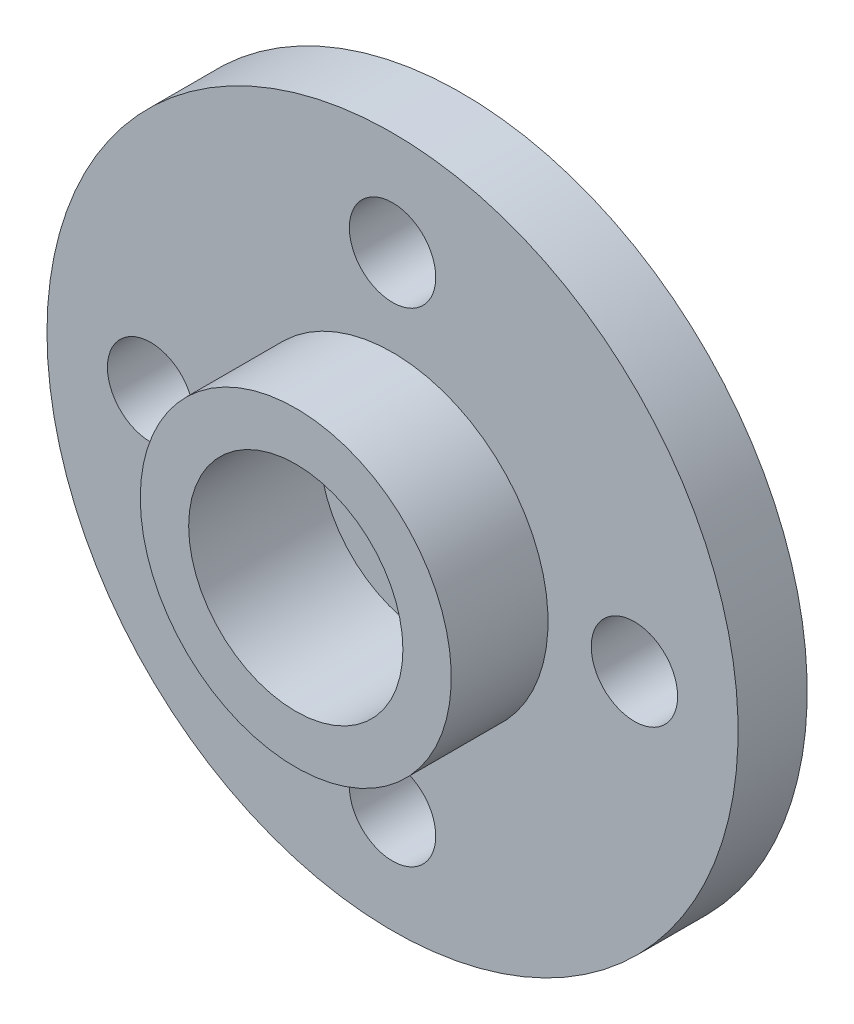
ISO-10303-21;
HEADER;
FILE_DESCRIPTION(('STEP AP214'),'2;1');
FILE_NAME('part.step','',(''),(''),'','','');
FILE_SCHEMA(('AUTOMOTIVE_DESIGN { 1 0 10303 214 1 1 1 1 }'));
ENDSEC;
DATA;
#1=APPLICATION_CONTEXT('core data for automotive mechanical design processes');
#2=APPLICATION_PROTOCOL_DEFINITION('international standard','automotive_design',2000,#1);
#3=PRODUCT_CONTEXT('',#1,'mechanical');
#4=PRODUCT('Part','Part','',(#3));
#5=PRODUCT_RELATED_PRODUCT_CATEGORY('part','',(#4));
#6=PRODUCT_DEFINITION_FORMATION('','',#4);
#7=PRODUCT_DEFINITION_CONTEXT('part definition',#1,'design');
#8=PRODUCT_DEFINITION('design','',#6,#7);
#9=PRODUCT_DEFINITION_SHAPE('','',#8);
#10=(LENGTH_UNIT() NAMED_UNIT(*) SI_UNIT(.MILLI.,.METRE.));
#11=(NAMED_UNIT(*) PLANE_ANGLE_UNIT() SI_UNIT($,.RADIAN.));
#12=(NAMED_UNIT(*) SI_UNIT($,.STERADIAN.) SOLID_ANGLE_UNIT());
#13=UNCERTAINTY_MEASURE_WITH_UNIT(LENGTH_MEASURE(1.E-05),#10,'distance_accuracy_value','');
#14=(GEOMETRIC_REPRESENTATION_CONTEXT(3) GLOBAL_UNCERTAINTY_ASSIGNED_CONTEXT((#13)) GLOBAL_UNIT_ASSIGNED_CONTEXT((#10,
#11,#12)) REPRESENTATION_CONTEXT('',''));
#15=CARTESIAN_POINT('',(0.,0.,0.));
#16=DIRECTION('',(0.,0.,1.));
#17=DIRECTION('',(1.,0.,0.));
#18=AXIS2_PLACEMENT_3D('',#15,#16,#17);
#19=CARTESIAN_POINT('',(-39.10264651977,-19.8999981269,-34.124));
#20=DIRECTION('',(0.,0.,-1.));
#21=DIRECTION('',(-1.,0.,0.));
#22=AXIS2_PLACEMENT_3D('',#19,#20,#21);
#23=CYLINDRICAL_SURFACE('',#22,10.);
#24=CARTESIAN_POINT('',(-39.10264651977,-19.8999981269,-34.124));
#25=DIRECTION('',(0.,0.,-1.));
#26=DIRECTION('',(-1.,0.,0.));
#27=AXIS2_PLACEMENT_3D('',#24,#25,#26);
#28=CIRCLE('',#27,10.);
#29=CARTESIAN_POINT('',(-49.10264651977,-19.8999981269,-34.124));
#30=VERTEX_POINT('',#29);
#31=EDGE_CURVE('E36',#30,#30,#28,.T.);
#32=ORIENTED_EDGE('',*,*,#31,.T.);
#33=EDGE_LOOP('',(#32));
#34=FACE_BOUND('',#33,.T.);
#35=CARTESIAN_POINT('',(-39.10264651977,-19.8999981269,-36.124));
#36=DIRECTION('',(0.,0.,-1.));
#37=DIRECTION('',(-1.,0.,0.));
#38=AXIS2_PLACEMENT_3D('',#35,#36,#37);
#39=CIRCLE('',#38,10.);
#40=CARTESIAN_POINT('',(-49.10264651977,-19.8999981269,-36.124));
#41=VERTEX_POINT('',#40);
#42=EDGE_CURVE('E46',#41,#41,#39,.T.);
#43=ORIENTED_EDGE('',*,*,#42,.F.);
#44=EDGE_LOOP('',(#43));
#45=FACE_BOUND('',#44,.T.);
#46=ADVANCED_FACE('F34',(#34,#45),#23,.T.);
#47=CARTESIAN_POINT('',(-29.10264651977,-19.8999981269,-34.124));
#48=DIRECTION('',(0.,0.,1.));
#49=DIRECTION('',(1.,0.,0.));
#50=AXIS2_PLACEMENT_3D('',#47,#48,#49);
#51=PLANE('',#50);
#52=CARTESIAN_POINT('',(-46.10264839287,-19.8999981269,-34.124));
#53=DIRECTION('',(0.,0.,1.));
#54=DIRECTION('',(1.,0.,0.));
#55=AXIS2_PLACEMENT_3D('',#52,#53,#54);
#56=CIRCLE('',#55,1.24999999999999);
#57=CARTESIAN_POINT('',(-44.85264839287,-19.8999981269,-34.124));
#58=VERTEX_POINT('',#57);
#59=EDGE_CURVE('E76',#58,#58,#56,.T.);
#60=ORIENTED_EDGE('',*,*,#59,.F.);
#61=EDGE_LOOP('',(#60));
#62=FACE_BOUND('',#61,.T.);
#63=CARTESIAN_POINT('',(-39.10264651977,-12.8999962538,-34.124));
#64=DIRECTION('',(0.,0.,1.));
#65=DIRECTION('',(1.,0.,0.));
#66=AXIS2_PLACEMENT_3D('',#63,#64,#65);
#67=CIRCLE('',#66,1.24999999999999);
#68=CARTESIAN_POINT('',(-37.85264651977,-12.8999962538,-34.124));
#69=VERTEX_POINT('',#68);
#70=EDGE_CURVE('E68',#69,#69,#67,.T.);
#71=ORIENTED_EDGE('',*,*,#70,.F.);
#72=EDGE_LOOP('',(#71));
#73=FACE_BOUND('',#72,.T.);
#74=CARTESIAN_POINT('',(-32.10264464667,-19.8999981269,-34.124));
#75=DIRECTION('',(0.,0.,1.));
#76=DIRECTION('',(1.,0.,0.));
#77=AXIS2_PLACEMENT_3D('',#74,#75,#76);
#78=CIRCLE('',#77,1.24999999999999);
#79=CARTESIAN_POINT('',(-30.85264464667,-19.8999981269,-34.124));
#80=VERTEX_POINT('',#79);
#81=EDGE_CURVE('E62',#80,#80,#78,.T.);
#82=ORIENTED_EDGE('',*,*,#81,.F.);
#83=EDGE_LOOP('',(#82));
#84=FACE_BOUND('',#83,.T.);
#85=CARTESIAN_POINT('',(-39.10264651977,-26.9,-34.124));
#86=DIRECTION('',(0.,0.,1.));
#87=DIRECTION('',(1.,0.,0.));
#88=AXIS2_PLACEMENT_3D('',#85,#86,#87);
#89=CIRCLE('',#88,1.24999999999999);
#90=CARTESIAN_POINT('',(-37.85264651977,-26.9,-34.124));
#91=VERTEX_POINT('',#90);
#92=EDGE_CURVE('E53',#91,#91,#89,.T.);
#93=ORIENTED_EDGE('',*,*,#92,.F.);
#94=EDGE_LOOP('',(#93));
#95=FACE_BOUND('',#94,.T.);
#96=CARTESIAN_POINT('',(-39.10264651977,-19.8999981269,-34.124));
#97=DIRECTION('',(0.,0.,1.));
#98=DIRECTION('',(1.,0.,0.));
#99=AXIS2_PLACEMENT_3D('',#96,#97,#98);
#100=CIRCLE('',#99,4.5);
#101=CARTESIAN_POINT('',(-43.60264651977,-19.8999981269,-34.124));
#102=VERTEX_POINT('',#101);
#103=EDGE_CURVE('E10',#102,#102,#100,.T.);
#104=ORIENTED_EDGE('',*,*,#103,.F.);
#105=EDGE_LOOP('',(#104));
#106=FACE_BOUND('',#105,.T.);
#107=ORIENTED_EDGE('',*,*,#31,.F.);
#108=EDGE_LOOP('',(#107));
#109=FACE_BOUND('',#108,.T.);
#110=ADVANCED_FACE('F111',(#62,#73,#84,#95,#106,#109),#51,.T.);
#111=CARTESIAN_POINT('',(-39.10264651977,-19.8999981269,-36.124));
#112=DIRECTION('',(0.,0.,-1.));
#113=DIRECTION('',(-1.,0.,0.));
#114=AXIS2_PLACEMENT_3D('',#111,#112,#113);
#115=PLANE('',#114);
#116=CARTESIAN_POINT('',(-39.10264651977,-19.8999981269,-36.124));
#117=DIRECTION('',(0.,0.,1.));
#118=DIRECTION('',(1.,0.,0.));
#119=AXIS2_PLACEMENT_3D('',#116,#117,#118);
#120=CIRCLE('',#119,1.60000000000001);
#121=CARTESIAN_POINT('',(-37.50264651977,-19.8999981269,-36.124));
#122=VERTEX_POINT('',#121);
#123=EDGE_CURVE('E85',#122,#122,#120,.T.);
#124=ORIENTED_EDGE('',*,*,#123,.T.);
#125=EDGE_LOOP('',(#124));
#126=FACE_BOUND('',#125,.T.);
#127=CARTESIAN_POINT('',(-46.10264839287,-19.8999981269,-36.124));
#128=DIRECTION('',(0.,0.,-1.));
#129=DIRECTION('',(-1.,0.,0.));
#130=AXIS2_PLACEMENT_3D('',#127,#128,#129);
#131=CIRCLE('',#130,1.24999999999999);
#132=CARTESIAN_POINT('',(-47.35264839287,-19.8999981269,-36.124));
#133=VERTEX_POINT('',#132);
#134=EDGE_CURVE('E78',#133,#133,#131,.T.);
#135=ORIENTED_EDGE('',*,*,#134,.F.);
#136=EDGE_LOOP('',(#135));
#137=FACE_BOUND('',#136,.T.);
#138=CARTESIAN_POINT('',(-39.10264651977,-12.8999962538,-36.124));
#139=DIRECTION('',(0.,0.,-1.));
#140=DIRECTION('',(-1.,0.,0.));
#141=AXIS2_PLACEMENT_3D('',#138,#139,#140);
#142=CIRCLE('',#141,1.24999999999999);
#143=CARTESIAN_POINT('',(-40.35264651977,-12.8999962538,-36.124));
#144=VERTEX_POINT('',#143);
#145=EDGE_CURVE('E71',#144,#144,#142,.T.);
#146=ORIENTED_EDGE('',*,*,#145,.F.);
#147=EDGE_LOOP('',(#146));
#148=FACE_BOUND('',#147,.T.);
#149=CARTESIAN_POINT('',(-32.10264464667,-19.8999981269,-36.124));
#150=DIRECTION('',(0.,0.,-1.));
#151=DIRECTION('',(-1.,0.,0.));
#152=AXIS2_PLACEMENT_3D('',#149,#150,#151);
#153=CIRCLE('',#152,1.24999999999999);
#154=CARTESIAN_POINT('',(-33.35264464667,-19.8999981269,-36.124));
#155=VERTEX_POINT('',#154);
#156=EDGE_CURVE('E70',#155,#155,#153,.T.);
#157=ORIENTED_EDGE('',*,*,#156,.F.);
#158=EDGE_LOOP('',(#157));
#159=FACE_BOUND('',#158,.T.);
#160=CARTESIAN_POINT('',(-39.10264651977,-26.9,-36.124));
#161=DIRECTION('',(0.,0.,-1.));
#162=DIRECTION('',(-1.,0.,0.));
#163=AXIS2_PLACEMENT_3D('',#160,#161,#162);
#164=CIRCLE('',#163,1.24999999999999);
#165=CARTESIAN_POINT('',(-40.35264651977,-26.9,-36.124));
#166=VERTEX_POINT('',#165);
#167=EDGE_CURVE('E59',#166,#166,#164,.T.);
#168=ORIENTED_EDGE('',*,*,#167,.F.);
#169=EDGE_LOOP('',(#168));
#170=FACE_BOUND('',#169,.T.);
#171=ORIENTED_EDGE('',*,*,#42,.T.);
#172=EDGE_LOOP('',(#171));
#173=FACE_BOUND('',#172,.T.);
#174=ADVANCED_FACE('F109',(#126,#137,#148,#159,#170,#173),#115,.T.);
#175=CARTESIAN_POINT('',(-39.10264651977,-19.8999981269,-31.324));
#176=DIRECTION('',(0.,0.,-1.));
#177=DIRECTION('',(-1.,0.,0.));
#178=AXIS2_PLACEMENT_3D('',#175,#176,#177);
#179=CYLINDRICAL_SURFACE('',#178,4.5);
#180=CARTESIAN_POINT('',(-39.10264651977,-19.8999981269,-31.324));
#181=DIRECTION('',(0.,0.,1.));
#182=DIRECTION('',(1.,0.,0.));
#183=AXIS2_PLACEMENT_3D('',#180,#181,#182);
#184=CIRCLE('',#183,4.5);
#185=CARTESIAN_POINT('',(-43.60264651977,-19.8999981269,-31.324));
#186=VERTEX_POINT('',#185);
#187=EDGE_CURVE('E48',#186,#186,#184,.T.);
#188=CARTESIAN_POINT('',(-43.60264651977,-19.8999981269,-31.324));
#189=CARTESIAN_POINT('',(-43.60264651977,-19.8999981269,-31.3531666666667));
#190=CARTESIAN_POINT('',(-43.60264651977,-19.8999981269,-31.3823333333333));
#191=CARTESIAN_POINT('',(-43.60264651977,-19.8999981269,-31.4406666666667));
#192=CARTESIAN_POINT('',(-43.60264651977,-19.8999981269,-31.4698333333333));
#193=CARTESIAN_POINT('',(-43.60264651977,-19.8999981269,-31.5281666666667));
#194=CARTESIAN_POINT('',(-43.60264651977,-19.8999981269,-31.5573333333333));
#195=CARTESIAN_POINT('',(-43.60264651977,-19.8999981269,-31.6156666666667));
#196=CARTESIAN_POINT('',(-43.60264651977,-19.8999981269,-31.6448333333333));
#197=CARTESIAN_POINT('',(-43.60264651977,-19.8999981269,-31.7031666666667));
#198=CARTESIAN_POINT('',(-43.60264651977,-19.8999981269,-31.7323333333333));
#199=CARTESIAN_POINT('',(-43.60264651977,-19.8999981269,-31.7906666666667));
#200=CARTESIAN_POINT('',(-43.60264651977,-19.8999981269,-31.8198333333333));
#201=CARTESIAN_POINT('',(-43.60264651977,-19.8999981269,-31.8781666666667));
#202=CARTESIAN_POINT('',(-43.60264651977,-19.8999981269,-31.9073333333333));
#203=CARTESIAN_POINT('',(-43.60264651977,-19.8999981269,-31.9656666666667));
#204=CARTESIAN_POINT('',(-43.60264651977,-19.8999981269,-31.9948333333333));
#205=CARTESIAN_POINT('',(-43.60264651977,-19.8999981269,-32.0531666666667));
#206=CARTESIAN_POINT('',(-43.60264651977,-19.8999981269,-32.0823333333333));
#207=CARTESIAN_POINT('',(-43.60264651977,-19.8999981269,-32.1406666666667));
#208=CARTESIAN_POINT('',(-43.60264651977,-19.8999981269,-32.1698333333333));
#209=CARTESIAN_POINT('',(-43.60264651977,-19.8999981269,-32.2281666666667));
#210=CARTESIAN_POINT('',(-43.60264651977,-19.8999981269,-32.2573333333333));
#211=CARTESIAN_POINT('',(-43.60264651977,-19.8999981269,-32.3156666666667));
#212=CARTESIAN_POINT('',(-43.60264651977,-19.8999981269,-32.3448333333333));
#213=CARTESIAN_POINT('',(-43.60264651977,-19.8999981269,-32.4031666666667));
#214=CARTESIAN_POINT('',(-43.60264651977,-19.8999981269,-32.4323333333333));
#215=CARTESIAN_POINT('',(-43.60264651977,-19.8999981269,-32.4906666666667));
#216=CARTESIAN_POINT('',(-43.60264651977,-19.8999981269,-32.5198333333333));
#217=CARTESIAN_POINT('',(-43.60264651977,-19.8999981269,-32.5781666666667));
#218=CARTESIAN_POINT('',(-43.60264651977,-19.8999981269,-32.6073333333333));
#219=CARTESIAN_POINT('',(-43.60264651977,-19.8999981269,-32.6656666666667));
#220=CARTESIAN_POINT('',(-43.60264651977,-19.8999981269,-32.6948333333333));
#221=CARTESIAN_POINT('',(-43.60264651977,-19.8999981269,-32.7531666666667));
#222=CARTESIAN_POINT('',(-43.60264651977,-19.8999981269,-32.7823333333333));
#223=CARTESIAN_POINT('',(-43.60264651977,-19.8999981269,-32.8406666666667));
#224=CARTESIAN_POINT('',(-43.60264651977,-19.8999981269,-32.8698333333333));
#225=CARTESIAN_POINT('',(-43.60264651977,-19.8999981269,-32.9281666666667));
#226=CARTESIAN_POINT('',(-43.60264651977,-19.8999981269,-32.9573333333333));
#227=CARTESIAN_POINT('',(-43.60264651977,-19.8999981269,-33.0156666666667));
#228=CARTESIAN_POINT('',(-43.60264651977,-19.8999981269,-33.0448333333333));
#229=CARTESIAN_POINT('',(-43.60264651977,-19.8999981269,-33.1031666666667));
#230=CARTESIAN_POINT('',(-43.60264651977,-19.8999981269,-33.1323333333333));
#231=CARTESIAN_POINT('',(-43.60264651977,-19.8999981269,-33.1906666666667));
#232=CARTESIAN_POINT('',(-43.60264651977,-19.8999981269,-33.2198333333333));
#233=CARTESIAN_POINT('',(-43.60264651977,-19.8999981269,-33.2781666666667));
#234=CARTESIAN_POINT('',(-43.60264651977,-19.8999981269,-33.3073333333333));
#235=CARTESIAN_POINT('',(-43.60264651977,-19.8999981269,-33.3656666666667));
#236=CARTESIAN_POINT('',(-43.60264651977,-19.8999981269,-33.3948333333333));
#237=CARTESIAN_POINT('',(-43.60264651977,-19.8999981269,-33.4531666666667));
#238=CARTESIAN_POINT('',(-43.60264651977,-19.8999981269,-33.4823333333333));
#239=CARTESIAN_POINT('',(-43.60264651977,-19.8999981269,-33.5406666666667));
#240=CARTESIAN_POINT('',(-43.60264651977,-19.8999981269,-33.5698333333333));
#241=CARTESIAN_POINT('',(-43.60264651977,-19.8999981269,-33.6281666666667));
#242=CARTESIAN_POINT('',(-43.60264651977,-19.8999981269,-33.6573333333333));
#243=CARTESIAN_POINT('',(-43.60264651977,-19.8999981269,-33.7156666666667));
#244=CARTESIAN_POINT('',(-43.60264651977,-19.8999981269,-33.7448333333333));
#245=CARTESIAN_POINT('',(-43.60264651977,-19.8999981269,-33.8031666666667));
#246=CARTESIAN_POINT('',(-43.60264651977,-19.8999981269,-33.8323333333333));
#247=CARTESIAN_POINT('',(-43.60264651977,-19.8999981269,-33.8906666666667));
#248=CARTESIAN_POINT('',(-43.60264651977,-19.8999981269,-33.9198333333333));
#249=CARTESIAN_POINT('',(-43.60264651977,-19.8999981269,-33.9781666666667));
#250=CARTESIAN_POINT('',(-43.60264651977,-19.8999981269,-34.0073333333333));
#251=CARTESIAN_POINT('',(-43.60264651977,-19.8999981269,-34.0656666666667));
#252=CARTESIAN_POINT('',(-43.60264651977,-19.8999981269,-34.0948333333333));
#253=CARTESIAN_POINT('',(-43.60264651977,-19.8999981269,-34.124));
#254=B_SPLINE_CURVE_WITH_KNOTS('',3,(#188,#189,#190,#191,#192,#193,#194,#195,#196,#197,#198,
#199,#200,#201,#202,#203,#204,#205,#206,#207,#208,#209,#210,#211,#212,#213,#214,#215,#216,#217,
#218,#219,#220,#221,#222,#223,#224,#225,#226,#227,#228,#229,#230,#231,#232,#233,#234,#235,#236,
#237,#238,#239,#240,#241,#242,#243,#244,#245,#246,#247,#248,#249,#250,#251,#252,#253),
.UNSPECIFIED.,.F.,.F.,(4,2,2,2,2,2,2,2,2,2,2,2,2,2,2,2,2,2,2,2,2,2,2,2,2,2,2,2,2,2,2,2,4),(0.,
0.0875000000000042,0.175000000000002,0.262500000000006,0.350000000000003,0.4375,
0.525000000000005,0.612500000000002,0.700000000000006,0.787500000000003,0.875000000000001,
0.962500000000005,1.05,1.1375,1.225,1.3125,1.40000000000001,1.4875,1.575,1.6625,1.75,1.8375,
1.925,2.0125,2.1,2.1875,2.275,2.3625,2.45,2.5375,2.625,2.7125,2.8),.UNSPECIFIED.);
#255=EDGE_CURVE('BSEAM99',#186,#102,#254,.T.);
#256=ORIENTED_EDGE('',*,*,#187,.F.);
#257=ORIENTED_EDGE('',*,*,#103,.T.);
#258=ORIENTED_EDGE('',*,*,#255,.T.);
#259=ORIENTED_EDGE('',*,*,#255,.F.);
#260=EDGE_LOOP('',(#256,#258,#257,#259));
#261=FACE_BOUND('',#260,.T.);
#262=ADVANCED_FACE('F99',(#261),#179,.T.);
#263=CARTESIAN_POINT('',(-39.10264651977,-19.8999981269,-31.324));
#264=DIRECTION('',(0.,0.,1.));
#265=DIRECTION('',(1.,0.,0.));
#266=AXIS2_PLACEMENT_3D('',#263,#264,#265);
#267=PLANE('',#266);
#268=CARTESIAN_POINT('',(-39.10264651977,-19.8999981269,-31.324));
#269=DIRECTION('',(0.,0.,1.));
#270=DIRECTION('',(1.,0.,0.));
#271=AXIS2_PLACEMENT_3D('',#268,#269,#270);
#272=CIRCLE('',#271,3.09999999999999);
#273=CARTESIAN_POINT('',(-36.00264651977,-19.8999981269,-31.324));
#274=VERTEX_POINT('',#273);
#275=EDGE_CURVE('E93',#274,#274,#272,.T.);
#276=ORIENTED_EDGE('',*,*,#275,.F.);
#277=EDGE_LOOP('',(#276));
#278=FACE_BOUND('',#277,.T.);
#279=ORIENTED_EDGE('',*,*,#187,.T.);
#280=EDGE_LOOP('',(#279));
#281=FACE_BOUND('',#280,.T.);
#282=ADVANCED_FACE('F100',(#278,#281),#267,.T.);
#283=CARTESIAN_POINT('',(-39.10264651977,-26.9,-36.124));
#284=DIRECTION('',(0.,0.,-1.));
#285=DIRECTION('',(-1.,0.,0.));
#286=AXIS2_PLACEMENT_3D('',#283,#284,#285);
#287=CYLINDRICAL_SURFACE('',#286,1.24999999999999);
#288=ORIENTED_EDGE('',*,*,#92,.T.);
#289=EDGE_LOOP('',(#288));
#290=FACE_BOUND('',#289,.T.);
#291=ORIENTED_EDGE('',*,*,#167,.T.);
#292=EDGE_LOOP('',(#291));
#293=FACE_BOUND('',#292,.T.);
#294=ADVANCED_FACE('F97',(#290,#293),#287,.F.);
#295=CARTESIAN_POINT('',(-32.10264464667,-19.8999981269,-36.124));
#296=DIRECTION('',(0.,0.,-1.));
#297=DIRECTION('',(-1.,0.,0.));
#298=AXIS2_PLACEMENT_3D('',#295,#296,#297);
#299=CYLINDRICAL_SURFACE('',#298,1.24999999999999);
#300=ORIENTED_EDGE('',*,*,#81,.T.);
#301=EDGE_LOOP('',(#300));
#302=FACE_BOUND('',#301,.T.);
#303=ORIENTED_EDGE('',*,*,#156,.T.);
#304=EDGE_LOOP('',(#303));
#305=FACE_BOUND('',#304,.T.);
#306=ADVANCED_FACE('F110',(#302,#305),#299,.F.);
#307=CARTESIAN_POINT('',(-39.10264651977,-12.8999962538,-36.124));
#308=DIRECTION('',(0.,0.,-1.));
#309=DIRECTION('',(-1.,0.,0.));
#310=AXIS2_PLACEMENT_3D('',#307,#308,#309);
#311=CYLINDRICAL_SURFACE('',#310,1.24999999999999);
#312=ORIENTED_EDGE('',*,*,#70,.T.);
#313=EDGE_LOOP('',(#312));
#314=FACE_BOUND('',#313,.T.);
#315=ORIENTED_EDGE('',*,*,#145,.T.);
#316=EDGE_LOOP('',(#315));
#317=FACE_BOUND('',#316,.T.);
#318=ADVANCED_FACE('F140',(#314,#317),#311,.F.);
#319=CARTESIAN_POINT('',(-46.10264839287,-19.8999981269,-36.124));
#320=DIRECTION('',(0.,0.,-1.));
#321=DIRECTION('',(-1.,0.,0.));
#322=AXIS2_PLACEMENT_3D('',#319,#320,#321);
#323=CYLINDRICAL_SURFACE('',#322,1.24999999999999);
#324=ORIENTED_EDGE('',*,*,#59,.T.);
#325=EDGE_LOOP('',(#324));
#326=FACE_BOUND('',#325,.T.);
#327=ORIENTED_EDGE('',*,*,#134,.T.);
#328=EDGE_LOOP('',(#327));
#329=FACE_BOUND('',#328,.T.);
#330=ADVANCED_FACE('F150',(#326,#329),#323,.F.);
#331=CARTESIAN_POINT('',(-39.10264651977,-19.8999981269,-31.324));
#332=DIRECTION('',(0.,0.,1.));
#333=DIRECTION('',(1.,0.,0.));
#334=AXIS2_PLACEMENT_3D('',#331,#332,#333);
#335=CYLINDRICAL_SURFACE('',#334,1.60000000000001);
#336=ORIENTED_EDGE('',*,*,#123,.F.);
#337=EDGE_LOOP('',(#336));
#338=FACE_BOUND('',#337,.T.);
#339=CARTESIAN_POINT('',(-39.10264651977,-19.8999981269,-35.124));
#340=DIRECTION('',(0.,0.,1.));
#341=DIRECTION('',(1.,0.,0.));
#342=AXIS2_PLACEMENT_3D('',#339,#340,#341);
#343=CIRCLE('',#342,1.60000000000001);
#344=CARTESIAN_POINT('',(-37.50264651977,-19.8999981269,-35.124));
#345=VERTEX_POINT('',#344);
#346=EDGE_CURVE('E83',#345,#345,#343,.T.);
#347=ORIENTED_EDGE('',*,*,#346,.T.);
#348=EDGE_LOOP('',(#347));
#349=FACE_BOUND('',#348,.T.);
#350=ADVANCED_FACE('F153',(#338,#349),#335,.F.);
#351=CARTESIAN_POINT('',(-37.50264651977,-19.8999981269,-35.124));
#352=DIRECTION('',(0.,0.,-1.));
#353=DIRECTION('',(-1.,0.,0.));
#354=AXIS2_PLACEMENT_3D('',#351,#352,#353);
#355=PLANE('',#354);
#356=ORIENTED_EDGE('',*,*,#346,.F.);
#357=EDGE_LOOP('',(#356));
#358=FACE_BOUND('',#357,.T.);
#359=CARTESIAN_POINT('',(-39.10264651977,-19.8999981269,-35.124));
#360=DIRECTION('',(0.,0.,1.));
#361=DIRECTION('',(1.,0.,0.));
#362=AXIS2_PLACEMENT_3D('',#359,#360,#361);
#363=CIRCLE('',#362,3.09999999999999);
#364=CARTESIAN_POINT('',(-36.00264651977,-19.8999981269,-35.124));
#365=VERTEX_POINT('',#364);
#366=EDGE_CURVE('E86',#365,#365,#363,.T.);
#367=ORIENTED_EDGE('',*,*,#366,.T.);
#368=EDGE_LOOP('',(#367));
#369=FACE_BOUND('',#368,.T.);
#370=ADVANCED_FACE('F156',(#358,#369),#355,.F.);
#371=CARTESIAN_POINT('',(-39.10264651977,-19.8999981269,-31.324));
#372=DIRECTION('',(0.,0.,1.));
#373=DIRECTION('',(1.,0.,0.));
#374=AXIS2_PLACEMENT_3D('',#371,#372,#373);
#375=CYLINDRICAL_SURFACE('',#374,3.09999999999999);
#376=ORIENTED_EDGE('',*,*,#366,.F.);
#377=EDGE_LOOP('',(#376));
#378=FACE_BOUND('',#377,.T.);
#379=ORIENTED_EDGE('',*,*,#275,.T.);
#380=EDGE_LOOP('',(#379));
#381=FACE_BOUND('',#380,.T.);
#382=ADVANCED_FACE('F92',(#378,#381),#375,.F.);
#383=CLOSED_SHELL('',(#46,#110,#174,#262,#282,#294,#306,#318,#330,#350,#370,#382));
#384=MANIFOLD_SOLID_BREP('B2',#383);
#385=ADVANCED_BREP_SHAPE_REPRESENTATION('',(#18,#384),#14);
#386=SHAPE_DEFINITION_REPRESENTATION(#9,#385);
ENDSEC;
END-ISO-10303-21;
